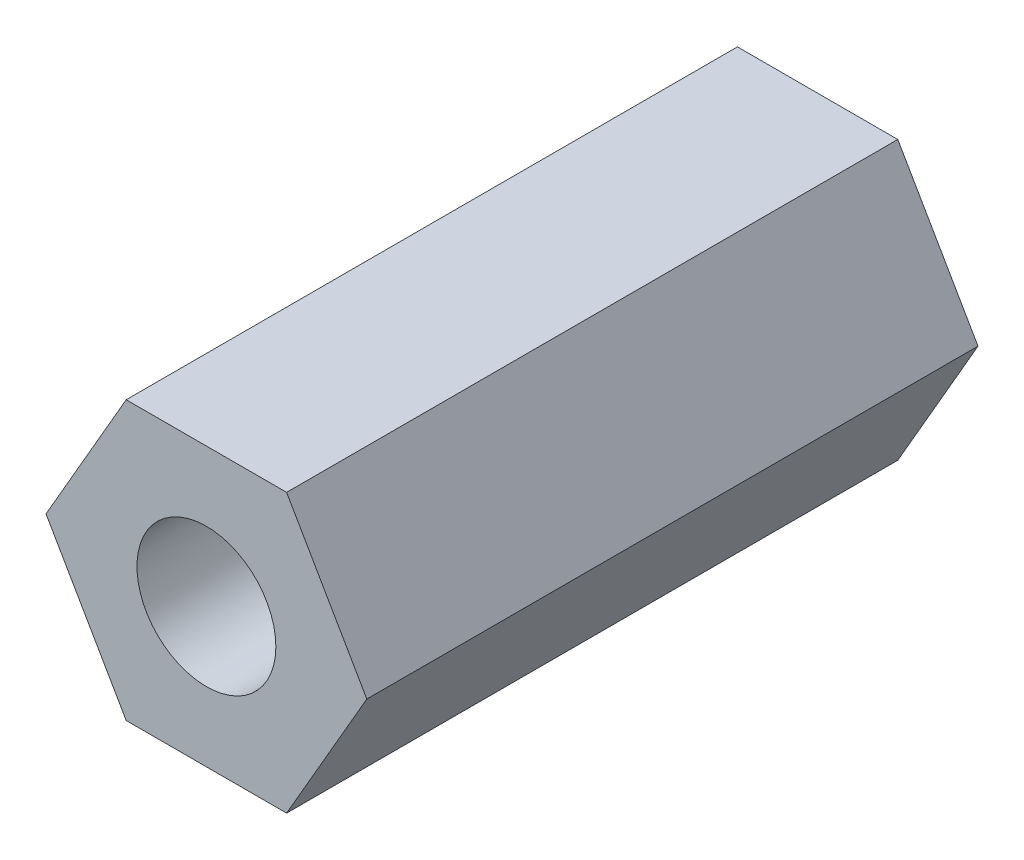
ISO-10303-21;
HEADER;
FILE_DESCRIPTION(('STEP AP214'),'2;1');
FILE_NAME('part.step','',(''),(''),'','','');
FILE_SCHEMA(('AUTOMOTIVE_DESIGN { 1 0 10303 214 1 1 1 1 }'));
ENDSEC;
DATA;
#1=APPLICATION_CONTEXT('core data for automotive mechanical design processes');
#2=APPLICATION_PROTOCOL_DEFINITION('international standard','automotive_design',2000,#1);
#3=PRODUCT_CONTEXT('',#1,'mechanical');
#4=PRODUCT('Part','Part','',(#3));
#5=PRODUCT_RELATED_PRODUCT_CATEGORY('part','',(#4));
#6=PRODUCT_DEFINITION_FORMATION('','',#4);
#7=PRODUCT_DEFINITION_CONTEXT('part definition',#1,'design');
#8=PRODUCT_DEFINITION('design','',#6,#7);
#9=PRODUCT_DEFINITION_SHAPE('','',#8);
#10=(LENGTH_UNIT() NAMED_UNIT(*) SI_UNIT(.MILLI.,.METRE.));
#11=(NAMED_UNIT(*) PLANE_ANGLE_UNIT() SI_UNIT($,.RADIAN.));
#12=(NAMED_UNIT(*) SI_UNIT($,.STERADIAN.) SOLID_ANGLE_UNIT());
#13=UNCERTAINTY_MEASURE_WITH_UNIT(LENGTH_MEASURE(1.E-05),#10,'distance_accuracy_value','');
#14=(GEOMETRIC_REPRESENTATION_CONTEXT(3) GLOBAL_UNCERTAINTY_ASSIGNED_CONTEXT((#13)) GLOBAL_UNIT_ASSIGNED_CONTEXT((#10,
#11,#12)) REPRESENTATION_CONTEXT('',''));
#15=CARTESIAN_POINT('',(0.,0.,0.));
#16=DIRECTION('',(0.,0.,1.));
#17=DIRECTION('',(1.,0.,0.));
#18=AXIS2_PLACEMENT_3D('',#15,#16,#17);
#19=CARTESIAN_POINT('',(0.,0.,11.));
#20=DIRECTION('',(0.,0.,1.));
#21=DIRECTION('',(1.,0.,0.));
#22=AXIS2_PLACEMENT_3D('',#19,#20,#21);
#23=PLANE('',#22);
#24=DIRECTION('',(0.5,0.866025403784439,0.));
#25=VECTOR('',#24,1.);
#26=CARTESIAN_POINT('',(1.44337567297406,-2.5,11.));
#27=LINE('',#26,#25);
#28=CARTESIAN_POINT('',(1.44337567297406,-2.5,11.));
#29=VERTEX_POINT('',#28);
#30=CARTESIAN_POINT('',(2.88675134594813,0.,11.));
#31=VERTEX_POINT('',#30);
#32=EDGE_CURVE('E149',#29,#31,#27,.T.);
#33=ORIENTED_EDGE('',*,*,#32,.T.);
#34=DIRECTION('',(-0.5,0.866025403784439,0.));
#35=VECTOR('',#34,1.);
#36=CARTESIAN_POINT('',(2.88675134594813,0.,11.));
#37=LINE('',#36,#35);
#38=CARTESIAN_POINT('',(1.44337567297406,2.5,11.));
#39=VERTEX_POINT('',#38);
#40=EDGE_CURVE('E96',#31,#39,#37,.T.);
#41=ORIENTED_EDGE('',*,*,#40,.T.);
#42=DIRECTION('',(-1.,0.,0.));
#43=VECTOR('',#42,1.);
#44=CARTESIAN_POINT('',(1.44337567297406,2.5,11.));
#45=LINE('',#44,#43);
#46=CARTESIAN_POINT('',(-1.44337567297406,2.5,11.));
#47=VERTEX_POINT('',#46);
#48=EDGE_CURVE('E109',#39,#47,#45,.T.);
#49=ORIENTED_EDGE('',*,*,#48,.T.);
#50=DIRECTION('',(-0.5,-0.866025403784439,0.));
#51=VECTOR('',#50,1.);
#52=CARTESIAN_POINT('',(-1.44337567297406,2.5,11.));
#53=LINE('',#52,#51);
#54=CARTESIAN_POINT('',(-2.88675134594813,0.,11.));
#55=VERTEX_POINT('',#54);
#56=EDGE_CURVE('E103',#47,#55,#53,.T.);
#57=ORIENTED_EDGE('',*,*,#56,.T.);
#58=DIRECTION('',(0.5,-0.866025403784439,0.));
#59=VECTOR('',#58,1.);
#60=CARTESIAN_POINT('',(-2.88675134594813,0.,11.));
#61=LINE('',#60,#59);
#62=CARTESIAN_POINT('',(-1.44337567297407,-2.5,11.));
#63=VERTEX_POINT('',#62);
#64=EDGE_CURVE('E107',#55,#63,#61,.T.);
#65=ORIENTED_EDGE('',*,*,#64,.T.);
#66=DIRECTION('',(1.,0.,0.));
#67=VECTOR('',#66,1.);
#68=CARTESIAN_POINT('',(-1.44337567297407,-2.5,11.));
#69=LINE('',#68,#67);
#70=EDGE_CURVE('E59',#63,#29,#69,.T.);
#71=ORIENTED_EDGE('',*,*,#70,.T.);
#72=EDGE_LOOP('',(#33,#41,#49,#57,#65,#71));
#73=FACE_BOUND('',#72,.T.);
#74=CARTESIAN_POINT('',(0.,0.,11.));
#75=DIRECTION('',(0.,0.,1.));
#76=DIRECTION('',(1.,0.,0.));
#77=AXIS2_PLACEMENT_3D('',#74,#75,#76);
#78=CIRCLE('',#77,1.25);
#79=CARTESIAN_POINT('',(1.25,0.,11.));
#80=VERTEX_POINT('',#79);
#81=EDGE_CURVE('E137',#80,#80,#78,.T.);
#82=ORIENTED_EDGE('',*,*,#81,.F.);
#83=EDGE_LOOP('',(#82));
#84=FACE_BOUND('',#83,.T.);
#85=ADVANCED_FACE('F41',(#73,#84),#23,.T.);
#86=CARTESIAN_POINT('',(0.,0.,0.));
#87=DIRECTION('',(0.,0.,1.));
#88=DIRECTION('',(1.,0.,0.));
#89=AXIS2_PLACEMENT_3D('',#86,#87,#88);
#90=PLANE('',#89);
#91=DIRECTION('',(0.5,0.866025403784439,0.));
#92=VECTOR('',#91,1.);
#93=CARTESIAN_POINT('',(1.44337567297406,-2.5,0.));
#94=LINE('',#93,#92);
#95=CARTESIAN_POINT('',(1.44337567297406,-2.5,0.));
#96=VERTEX_POINT('',#95);
#97=CARTESIAN_POINT('',(2.88675134594813,0.,0.));
#98=VERTEX_POINT('',#97);
#99=EDGE_CURVE('E132',#96,#98,#94,.T.);
#100=ORIENTED_EDGE('',*,*,#99,.F.);
#101=DIRECTION('',(1.,0.,0.));
#102=VECTOR('',#101,1.);
#103=CARTESIAN_POINT('',(-1.44337567297407,-2.5,0.));
#104=LINE('',#103,#102);
#105=CARTESIAN_POINT('',(-1.44337567297407,-2.5,0.));
#106=VERTEX_POINT('',#105);
#107=EDGE_CURVE('E88',#106,#96,#104,.T.);
#108=ORIENTED_EDGE('',*,*,#107,.F.);
#109=DIRECTION('',(0.5,-0.866025403784439,0.));
#110=VECTOR('',#109,1.);
#111=CARTESIAN_POINT('',(-2.88675134594813,0.,0.));
#112=LINE('',#111,#110);
#113=CARTESIAN_POINT('',(-2.88675134594813,0.,0.));
#114=VERTEX_POINT('',#113);
#115=EDGE_CURVE('E82',#114,#106,#112,.T.);
#116=ORIENTED_EDGE('',*,*,#115,.F.);
#117=DIRECTION('',(-0.5,-0.866025403784439,0.));
#118=VECTOR('',#117,1.);
#119=CARTESIAN_POINT('',(-1.44337567297406,2.5,0.));
#120=LINE('',#119,#118);
#121=CARTESIAN_POINT('',(-1.44337567297406,2.5,0.));
#122=VERTEX_POINT('',#121);
#123=EDGE_CURVE('E118',#122,#114,#120,.T.);
#124=ORIENTED_EDGE('',*,*,#123,.F.);
#125=DIRECTION('',(-1.,0.,0.));
#126=VECTOR('',#125,1.);
#127=CARTESIAN_POINT('',(1.44337567297406,2.5,0.));
#128=LINE('',#127,#126);
#129=CARTESIAN_POINT('',(1.44337567297406,2.5,0.));
#130=VERTEX_POINT('',#129);
#131=EDGE_CURVE('E140',#130,#122,#128,.T.);
#132=ORIENTED_EDGE('',*,*,#131,.F.);
#133=DIRECTION('',(-0.5,0.866025403784439,0.));
#134=VECTOR('',#133,1.);
#135=CARTESIAN_POINT('',(2.88675134594813,0.,0.));
#136=LINE('',#135,#134);
#137=EDGE_CURVE('E136',#98,#130,#136,.T.);
#138=ORIENTED_EDGE('',*,*,#137,.F.);
#139=EDGE_LOOP('',(#100,#108,#116,#124,#132,#138));
#140=FACE_BOUND('',#139,.T.);
#141=CARTESIAN_POINT('',(0.,0.,0.));
#142=DIRECTION('',(0.,0.,1.));
#143=DIRECTION('',(1.,0.,0.));
#144=AXIS2_PLACEMENT_3D('',#141,#142,#143);
#145=CIRCLE('',#144,1.25);
#146=CARTESIAN_POINT('',(1.25,0.,0.));
#147=VERTEX_POINT('',#146);
#148=EDGE_CURVE('E247',#147,#147,#145,.T.);
#149=ORIENTED_EDGE('',*,*,#148,.T.);
#150=EDGE_LOOP('',(#149));
#151=FACE_BOUND('',#150,.T.);
#152=ADVANCED_FACE('F163',(#140,#151),#90,.F.);
#153=CARTESIAN_POINT('',(1.44337567297406,-2.5,11.));
#154=DIRECTION('',(-0.866025403784439,0.5,0.));
#155=DIRECTION('',(-0.5,-0.866025403784439,0.));
#156=AXIS2_PLACEMENT_3D('',#153,#154,#155);
#157=PLANE('',#156);
#158=ORIENTED_EDGE('',*,*,#99,.T.);
#159=DIRECTION('',(0.,0.,-1.));
#160=VECTOR('',#159,1.);
#161=CARTESIAN_POINT('',(2.88675134594813,0.,11.));
#162=LINE('',#161,#160);
#163=EDGE_CURVE('E11',#31,#98,#162,.T.);
#164=ORIENTED_EDGE('',*,*,#163,.F.);
#165=ORIENTED_EDGE('',*,*,#32,.F.);
#166=DIRECTION('',(0.,0.,-1.));
#167=VECTOR('',#166,1.);
#168=CARTESIAN_POINT('',(1.44337567297406,-2.5,11.));
#169=LINE('',#168,#167);
#170=EDGE_CURVE('E128',#29,#96,#169,.T.);
#171=ORIENTED_EDGE('',*,*,#170,.T.);
#172=EDGE_LOOP('',(#158,#164,#165,#171));
#173=FACE_BOUND('',#172,.T.);
#174=ADVANCED_FACE('F43',(#173),#157,.F.);
#175=CARTESIAN_POINT('',(2.88675134594813,0.,11.));
#176=DIRECTION('',(-0.866025403784439,-0.5,0.));
#177=DIRECTION('',(0.5,-0.866025403784439,0.));
#178=AXIS2_PLACEMENT_3D('',#175,#176,#177);
#179=PLANE('',#178);
#180=ORIENTED_EDGE('',*,*,#137,.T.);
#181=DIRECTION('',(0.,0.,-1.));
#182=VECTOR('',#181,1.);
#183=CARTESIAN_POINT('',(1.44337567297406,2.5,11.));
#184=LINE('',#183,#182);
#185=EDGE_CURVE('E51',#39,#130,#184,.T.);
#186=ORIENTED_EDGE('',*,*,#185,.F.);
#187=ORIENTED_EDGE('',*,*,#40,.F.);
#188=ORIENTED_EDGE('',*,*,#163,.T.);
#189=EDGE_LOOP('',(#180,#186,#187,#188));
#190=FACE_BOUND('',#189,.T.);
#191=ADVANCED_FACE('F188',(#190),#179,.F.);
#192=CARTESIAN_POINT('',(1.44337567297406,2.5,11.));
#193=DIRECTION('',(0.,-1.,0.));
#194=DIRECTION('',(1.,0.,0.));
#195=AXIS2_PLACEMENT_3D('',#192,#193,#194);
#196=PLANE('',#195);
#197=ORIENTED_EDGE('',*,*,#131,.T.);
#198=DIRECTION('',(0.,0.,-1.));
#199=VECTOR('',#198,1.);
#200=CARTESIAN_POINT('',(-1.44337567297406,2.5,11.));
#201=LINE('',#200,#199);
#202=EDGE_CURVE('E120',#47,#122,#201,.T.);
#203=ORIENTED_EDGE('',*,*,#202,.F.);
#204=ORIENTED_EDGE('',*,*,#48,.F.);
#205=ORIENTED_EDGE('',*,*,#185,.T.);
#206=EDGE_LOOP('',(#197,#203,#204,#205));
#207=FACE_BOUND('',#206,.T.);
#208=ADVANCED_FACE('F160',(#207),#196,.F.);
#209=CARTESIAN_POINT('',(-1.44337567297406,2.5,11.));
#210=DIRECTION('',(0.866025403784438,-0.5,0.));
#211=DIRECTION('',(0.5,0.866025403784439,0.));
#212=AXIS2_PLACEMENT_3D('',#209,#210,#211);
#213=PLANE('',#212);
#214=ORIENTED_EDGE('',*,*,#123,.T.);
#215=DIRECTION('',(0.,0.,-1.));
#216=VECTOR('',#215,1.);
#217=CARTESIAN_POINT('',(-2.88675134594813,0.,11.));
#218=LINE('',#217,#216);
#219=EDGE_CURVE('E115',#55,#114,#218,.T.);
#220=ORIENTED_EDGE('',*,*,#219,.F.);
#221=ORIENTED_EDGE('',*,*,#56,.F.);
#222=ORIENTED_EDGE('',*,*,#202,.T.);
#223=EDGE_LOOP('',(#214,#220,#221,#222));
#224=FACE_BOUND('',#223,.T.);
#225=ADVANCED_FACE('F116',(#224),#213,.F.);
#226=CARTESIAN_POINT('',(-2.88675134594813,0.,11.));
#227=DIRECTION('',(0.866025403784439,0.5,0.));
#228=DIRECTION('',(-0.5,0.866025403784439,0.));
#229=AXIS2_PLACEMENT_3D('',#226,#227,#228);
#230=PLANE('',#229);
#231=ORIENTED_EDGE('',*,*,#115,.T.);
#232=DIRECTION('',(0.,0.,-1.));
#233=VECTOR('',#232,1.);
#234=CARTESIAN_POINT('',(-1.44337567297407,-2.5,11.));
#235=LINE('',#234,#233);
#236=EDGE_CURVE('E121',#63,#106,#235,.T.);
#237=ORIENTED_EDGE('',*,*,#236,.F.);
#238=ORIENTED_EDGE('',*,*,#64,.F.);
#239=ORIENTED_EDGE('',*,*,#219,.T.);
#240=EDGE_LOOP('',(#231,#237,#238,#239));
#241=FACE_BOUND('',#240,.T.);
#242=ADVANCED_FACE('F123',(#241),#230,.F.);
#243=CARTESIAN_POINT('',(-1.44337567297407,-2.5,11.));
#244=DIRECTION('',(0.,1.,0.));
#245=DIRECTION('',(-1.,0.,0.));
#246=AXIS2_PLACEMENT_3D('',#243,#244,#245);
#247=PLANE('',#246);
#248=ORIENTED_EDGE('',*,*,#107,.T.);
#249=ORIENTED_EDGE('',*,*,#170,.F.);
#250=ORIENTED_EDGE('',*,*,#70,.F.);
#251=ORIENTED_EDGE('',*,*,#236,.T.);
#252=EDGE_LOOP('',(#248,#249,#250,#251));
#253=FACE_BOUND('',#252,.T.);
#254=ADVANCED_FACE('F168',(#253),#247,.F.);
#255=CARTESIAN_POINT('',(0.,0.,11.));
#256=DIRECTION('',(0.,0.,-1.));
#257=DIRECTION('',(-1.,0.,0.));
#258=AXIS2_PLACEMENT_3D('',#255,#256,#257);
#259=CYLINDRICAL_SURFACE('',#258,1.25);
#260=ORIENTED_EDGE('',*,*,#81,.T.);
#261=EDGE_LOOP('',(#260));
#262=FACE_BOUND('',#261,.T.);
#263=ORIENTED_EDGE('',*,*,#148,.F.);
#264=EDGE_LOOP('',(#263));
#265=FACE_BOUND('',#264,.T.);
#266=ADVANCED_FACE('F170',(#262,#265),#259,.F.);
#267=CLOSED_SHELL('',(#85,#152,#174,#191,#208,#225,#242,#254,#266));
#268=MANIFOLD_SOLID_BREP('B2',#267);
#269=ADVANCED_BREP_SHAPE_REPRESENTATION('',(#18,#268),#14);
#270=SHAPE_DEFINITION_REPRESENTATION(#9,#269);
ENDSEC;
END-ISO-10303-21;
